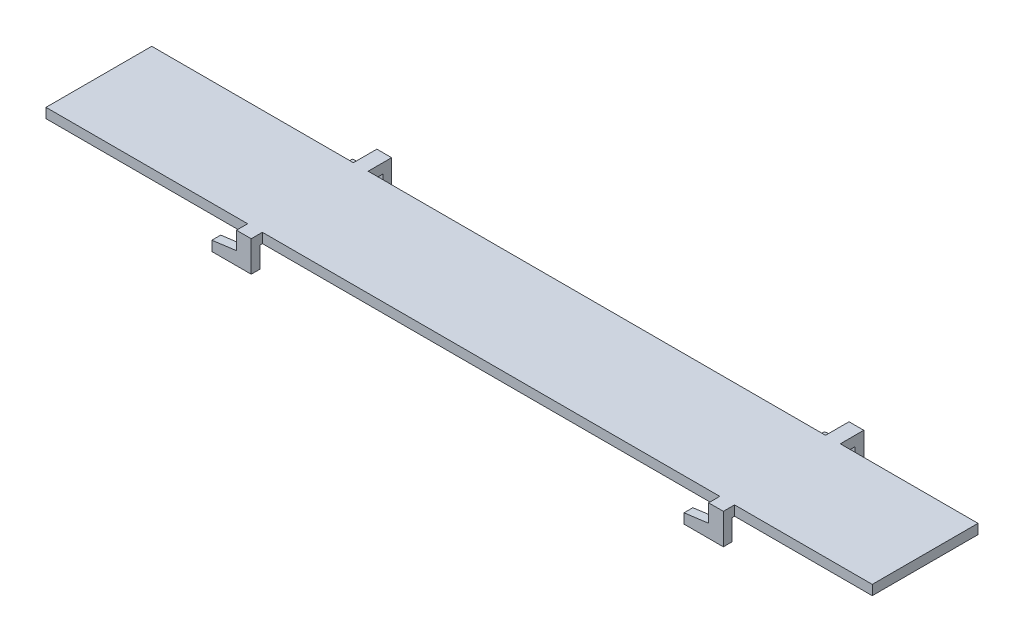
ISO-10303-21;
HEADER;
FILE_DESCRIPTION(('STEP AP214'),'2;1');
FILE_NAME('part.step','',(''),(''),'','','');
FILE_SCHEMA(('AUTOMOTIVE_DESIGN { 1 0 10303 214 1 1 1 1 }'));
ENDSEC;
DATA;
#1=APPLICATION_CONTEXT('core data for automotive mechanical design processes');
#2=APPLICATION_PROTOCOL_DEFINITION('international standard','automotive_design',2000,#1);
#3=PRODUCT_CONTEXT('',#1,'mechanical');
#4=PRODUCT('Part','Part','',(#3));
#5=PRODUCT_RELATED_PRODUCT_CATEGORY('part','',(#4));
#6=PRODUCT_DEFINITION_FORMATION('','',#4);
#7=PRODUCT_DEFINITION_CONTEXT('part definition',#1,'design');
#8=PRODUCT_DEFINITION('design','',#6,#7);
#9=PRODUCT_DEFINITION_SHAPE('','',#8);
#10=(LENGTH_UNIT() NAMED_UNIT(*) SI_UNIT(.MILLI.,.METRE.));
#11=(NAMED_UNIT(*) PLANE_ANGLE_UNIT() SI_UNIT($,.RADIAN.));
#12=(NAMED_UNIT(*) SI_UNIT($,.STERADIAN.) SOLID_ANGLE_UNIT());
#13=UNCERTAINTY_MEASURE_WITH_UNIT(LENGTH_MEASURE(1.E-05),#10,'distance_accuracy_value','');
#14=(GEOMETRIC_REPRESENTATION_CONTEXT(3) GLOBAL_UNCERTAINTY_ASSIGNED_CONTEXT((#13)) GLOBAL_UNIT_ASSIGNED_CONTEXT((#10,
#11,#12)) REPRESENTATION_CONTEXT('',''));
#15=CARTESIAN_POINT('',(0.,0.,0.));
#16=DIRECTION('',(0.,0.,1.));
#17=DIRECTION('',(1.,0.,0.));
#18=AXIS2_PLACEMENT_3D('',#15,#16,#17);
#19=CARTESIAN_POINT('',(-168.,2.,0.));
#20=DIRECTION('',(1.,0.,0.));
#21=DIRECTION('',(0.,0.,-1.));
#22=AXIS2_PLACEMENT_3D('',#19,#20,#21);
#23=PLANE('',#22);
#24=DIRECTION('',(0.,0.,1.));
#25=VECTOR('',#24,1.);
#26=CARTESIAN_POINT('',(-168.,0.,0.));
#27=LINE('',#26,#25);
#28=CARTESIAN_POINT('',(-168.,0.,0.));
#29=VERTEX_POINT('',#28);
#30=CARTESIAN_POINT('',(-168.,0.,21.5));
#31=VERTEX_POINT('',#30);
#32=EDGE_CURVE('E433',#29,#31,#27,.T.);
#33=ORIENTED_EDGE('',*,*,#32,.T.);
#34=DIRECTION('',(0.,-1.,0.));
#35=VECTOR('',#34,1.);
#36=CARTESIAN_POINT('',(-168.,2.,21.5));
#37=LINE('',#36,#35);
#38=CARTESIAN_POINT('',(-168.,2.,21.5));
#39=VERTEX_POINT('',#38);
#40=EDGE_CURVE('E533',#39,#31,#37,.T.);
#41=ORIENTED_EDGE('',*,*,#40,.F.);
#42=DIRECTION('',(0.,0.,1.));
#43=VECTOR('',#42,1.);
#44=CARTESIAN_POINT('',(-168.,2.,0.));
#45=LINE('',#44,#43);
#46=CARTESIAN_POINT('',(-168.,2.,0.));
#47=VERTEX_POINT('',#46);
#48=EDGE_CURVE('E434',#47,#39,#45,.T.);
#49=ORIENTED_EDGE('',*,*,#48,.F.);
#50=DIRECTION('',(0.,-1.,0.));
#51=VECTOR('',#50,1.);
#52=CARTESIAN_POINT('',(-168.,2.,0.));
#53=LINE('',#52,#51);
#54=EDGE_CURVE('E468',#47,#29,#53,.T.);
#55=ORIENTED_EDGE('',*,*,#54,.T.);
#56=EDGE_LOOP('',(#33,#41,#49,#55));
#57=FACE_BOUND('',#56,.T.);
#58=ADVANCED_FACE('F37',(#57),#23,.F.);
#59=CARTESIAN_POINT('',(-168.,2.,21.5));
#60=DIRECTION('',(0.,0.,-1.));
#61=DIRECTION('',(-1.,0.,0.));
#62=AXIS2_PLACEMENT_3D('',#59,#60,#61);
#63=PLANE('',#62);
#64=DIRECTION('',(1.,0.,0.));
#65=VECTOR('',#64,1.);
#66=CARTESIAN_POINT('',(-168.,0.,21.5));
#67=LINE('',#66,#65);
#68=CARTESIAN_POINT('',(-127.,0.,21.5));
#69=VERTEX_POINT('',#68);
#70=EDGE_CURVE('E471',#31,#69,#67,.T.);
#71=ORIENTED_EDGE('',*,*,#70,.T.);
#72=DIRECTION('',(0.,-1.,0.));
#73=VECTOR('',#72,1.);
#74=CARTESIAN_POINT('',(-127.,2.,21.5));
#75=LINE('',#74,#73);
#76=CARTESIAN_POINT('',(-127.,2.,21.5));
#77=VERTEX_POINT('',#76);
#78=EDGE_CURVE('E530',#77,#69,#75,.T.);
#79=ORIENTED_EDGE('',*,*,#78,.F.);
#80=DIRECTION('',(1.,0.,0.));
#81=VECTOR('',#80,1.);
#82=CARTESIAN_POINT('',(-168.,2.,21.5));
#83=LINE('',#82,#81);
#84=EDGE_CURVE('E437',#39,#77,#83,.T.);
#85=ORIENTED_EDGE('',*,*,#84,.F.);
#86=ORIENTED_EDGE('',*,*,#40,.T.);
#87=EDGE_LOOP('',(#71,#79,#85,#86));
#88=FACE_BOUND('',#87,.T.);
#89=ADVANCED_FACE('F555',(#88),#63,.F.);
#90=CARTESIAN_POINT('',(-127.,2.,22.875));
#91=DIRECTION('',(1.,0.,0.));
#92=DIRECTION('',(0.,0.,-1.));
#93=AXIS2_PLACEMENT_3D('',#90,#91,#92);
#94=PLANE('',#93);
#95=DIRECTION('',(0.,0.,1.));
#96=VECTOR('',#95,1.);
#97=CARTESIAN_POINT('',(-127.,0.,22.875));
#98=LINE('',#97,#96);
#99=CARTESIAN_POINT('',(-127.,0.,21.975));
#100=VERTEX_POINT('',#99);
#101=EDGE_CURVE('E473',#69,#100,#98,.T.);
#102=ORIENTED_EDGE('',*,*,#101,.T.);
#103=DIRECTION('',(0.,-1.,0.));
#104=VECTOR('',#103,1.);
#105=CARTESIAN_POINT('',(-127.,-1.6,21.975));
#106=LINE('',#105,#104);
#107=CARTESIAN_POINT('',(-127.,-1.6,21.975));
#108=VERTEX_POINT('',#107);
#109=EDGE_CURVE('E58',#100,#108,#106,.T.);
#110=ORIENTED_EDGE('',*,*,#109,.T.);
#111=DIRECTION('',(0.,0.,-1.));
#112=VECTOR('',#111,1.);
#113=CARTESIAN_POINT('',(-127.,-1.6,23.775));
#114=LINE('',#113,#112);
#115=CARTESIAN_POINT('',(-127.,-1.6,23.775));
#116=VERTEX_POINT('',#115);
#117=EDGE_CURVE('E352',#116,#108,#114,.T.);
#118=ORIENTED_EDGE('',*,*,#117,.F.);
#119=DIRECTION('',(0.,-1.,0.));
#120=VECTOR('',#119,1.);
#121=CARTESIAN_POINT('',(-127.,-1.6,23.775));
#122=LINE('',#121,#120);
#123=CARTESIAN_POINT('',(-127.,2.,23.775));
#124=VERTEX_POINT('',#123);
#125=EDGE_CURVE('E331',#124,#116,#122,.T.);
#126=ORIENTED_EDGE('',*,*,#125,.F.);
#127=DIRECTION('',(0.,0.,1.));
#128=VECTOR('',#127,1.);
#129=CARTESIAN_POINT('',(-127.,2.,22.875));
#130=LINE('',#129,#128);
#131=EDGE_CURVE('E440',#77,#124,#130,.T.);
#132=ORIENTED_EDGE('',*,*,#131,.F.);
#133=ORIENTED_EDGE('',*,*,#78,.T.);
#134=EDGE_LOOP('',(#102,#110,#118,#126,#132,#133));
#135=FACE_BOUND('',#134,.T.);
#136=ADVANCED_FACE('F549',(#135),#94,.F.);
#137=CARTESIAN_POINT('',(-124.,2.,21.5));
#138=DIRECTION('',(-1.,0.,0.));
#139=DIRECTION('',(0.,0.,1.));
#140=AXIS2_PLACEMENT_3D('',#137,#138,#139);
#141=PLANE('',#140);
#142=DIRECTION('',(0.,0.,-1.));
#143=VECTOR('',#142,1.);
#144=CARTESIAN_POINT('',(-124.,2.,21.5));
#145=LINE('',#144,#143);
#146=CARTESIAN_POINT('',(-124.,2.,23.775));
#147=VERTEX_POINT('',#146);
#148=CARTESIAN_POINT('',(-124.,2.,21.5));
#149=VERTEX_POINT('',#148);
#150=EDGE_CURVE('E442',#147,#149,#145,.T.);
#151=ORIENTED_EDGE('',*,*,#150,.F.);
#152=DIRECTION('',(0.,1.,0.));
#153=VECTOR('',#152,1.);
#154=CARTESIAN_POINT('',(-124.,2.,23.775));
#155=LINE('',#154,#153);
#156=CARTESIAN_POINT('',(-124.,-4.25826248793698,23.775));
#157=VERTEX_POINT('',#156);
#158=EDGE_CURVE('E340',#157,#147,#155,.T.);
#159=ORIENTED_EDGE('',*,*,#158,.F.);
#160=DIRECTION('',(0.,0.,-1.));
#161=VECTOR('',#160,1.);
#162=CARTESIAN_POINT('',(-124.,-4.25826248793698,23.775));
#163=LINE('',#162,#161);
#164=CARTESIAN_POINT('',(-124.,-4.25826248793698,21.975));
#165=VERTEX_POINT('',#164);
#166=EDGE_CURVE('E346',#157,#165,#163,.T.);
#167=ORIENTED_EDGE('',*,*,#166,.T.);
#168=DIRECTION('',(0.,1.,0.));
#169=VECTOR('',#168,1.);
#170=CARTESIAN_POINT('',(-124.,2.,21.975));
#171=LINE('',#170,#169);
#172=CARTESIAN_POINT('',(-124.,0.,21.975));
#173=VERTEX_POINT('',#172);
#174=EDGE_CURVE('E328',#165,#173,#171,.T.);
#175=ORIENTED_EDGE('',*,*,#174,.T.);
#176=DIRECTION('',(0.,0.,-1.));
#177=VECTOR('',#176,1.);
#178=CARTESIAN_POINT('',(-124.,0.,21.5));
#179=LINE('',#178,#177);
#180=CARTESIAN_POINT('',(-124.,0.,21.5));
#181=VERTEX_POINT('',#180);
#182=EDGE_CURVE('E476',#173,#181,#179,.T.);
#183=ORIENTED_EDGE('',*,*,#182,.T.);
#184=DIRECTION('',(0.,-1.,0.));
#185=VECTOR('',#184,1.);
#186=CARTESIAN_POINT('',(-124.,2.,21.5));
#187=LINE('',#186,#185);
#188=EDGE_CURVE('E527',#149,#181,#187,.T.);
#189=ORIENTED_EDGE('',*,*,#188,.F.);
#190=EDGE_LOOP('',(#151,#159,#167,#175,#183,#189));
#191=FACE_BOUND('',#190,.T.);
#192=ADVANCED_FACE('F653',(#191),#141,.F.);
#193=CARTESIAN_POINT('',(-124.,2.,21.5));
#194=DIRECTION('',(0.,0.,-1.));
#195=DIRECTION('',(-1.,0.,0.));
#196=AXIS2_PLACEMENT_3D('',#193,#194,#195);
#197=PLANE('',#196);
#198=DIRECTION('',(1.,0.,0.));
#199=VECTOR('',#198,1.);
#200=CARTESIAN_POINT('',(-124.,0.,21.5));
#201=LINE('',#200,#199);
#202=CARTESIAN_POINT('',(-31.,0.,21.5));
#203=VERTEX_POINT('',#202);
#204=EDGE_CURVE('E478',#181,#203,#201,.T.);
#205=ORIENTED_EDGE('',*,*,#204,.T.);
#206=DIRECTION('',(0.,-1.,0.));
#207=VECTOR('',#206,1.);
#208=CARTESIAN_POINT('',(-31.,2.,21.5));
#209=LINE('',#208,#207);
#210=CARTESIAN_POINT('',(-31.,2.,21.5));
#211=VERTEX_POINT('',#210);
#212=EDGE_CURVE('E524',#211,#203,#209,.T.);
#213=ORIENTED_EDGE('',*,*,#212,.F.);
#214=DIRECTION('',(1.,0.,0.));
#215=VECTOR('',#214,1.);
#216=CARTESIAN_POINT('',(-124.,2.,21.5));
#217=LINE('',#216,#215);
#218=EDGE_CURVE('E444',#149,#211,#217,.T.);
#219=ORIENTED_EDGE('',*,*,#218,.F.);
#220=ORIENTED_EDGE('',*,*,#188,.T.);
#221=EDGE_LOOP('',(#205,#213,#219,#220));
#222=FACE_BOUND('',#221,.T.);
#223=ADVANCED_FACE('F649',(#222),#197,.F.);
#224=CARTESIAN_POINT('',(-31.,2.,21.5));
#225=DIRECTION('',(1.,0.,0.));
#226=DIRECTION('',(0.,0.,-1.));
#227=AXIS2_PLACEMENT_3D('',#224,#225,#226);
#228=PLANE('',#227);
#229=DIRECTION('',(0.,0.,1.));
#230=VECTOR('',#229,1.);
#231=CARTESIAN_POINT('',(-31.,0.,21.5));
#232=LINE('',#231,#230);
#233=CARTESIAN_POINT('',(-31.,0.,21.975));
#234=VERTEX_POINT('',#233);
#235=EDGE_CURVE('E480',#203,#234,#232,.T.);
#236=ORIENTED_EDGE('',*,*,#235,.T.);
#237=DIRECTION('',(0.,-1.,0.));
#238=VECTOR('',#237,1.);
#239=CARTESIAN_POINT('',(-31.,-1.6,21.975));
#240=LINE('',#239,#238);
#241=CARTESIAN_POINT('',(-31.,-1.6,21.975));
#242=VERTEX_POINT('',#241);
#243=EDGE_CURVE('E389',#234,#242,#240,.T.);
#244=ORIENTED_EDGE('',*,*,#243,.T.);
#245=DIRECTION('',(0.,0.,-1.));
#246=VECTOR('',#245,1.);
#247=CARTESIAN_POINT('',(-31.,-1.6,23.775));
#248=LINE('',#247,#246);
#249=CARTESIAN_POINT('',(-31.,-1.6,23.775));
#250=VERTEX_POINT('',#249);
#251=EDGE_CURVE('E430',#250,#242,#248,.T.);
#252=ORIENTED_EDGE('',*,*,#251,.F.);
#253=DIRECTION('',(0.,-1.,0.));
#254=VECTOR('',#253,1.);
#255=CARTESIAN_POINT('',(-31.,-1.6,23.775));
#256=LINE('',#255,#254);
#257=CARTESIAN_POINT('',(-31.,2.,23.775));
#258=VERTEX_POINT('',#257);
#259=EDGE_CURVE('E409',#258,#250,#256,.T.);
#260=ORIENTED_EDGE('',*,*,#259,.F.);
#261=DIRECTION('',(0.,0.,1.));
#262=VECTOR('',#261,1.);
#263=CARTESIAN_POINT('',(-31.,2.,21.5));
#264=LINE('',#263,#262);
#265=EDGE_CURVE('E446',#211,#258,#264,.T.);
#266=ORIENTED_EDGE('',*,*,#265,.F.);
#267=ORIENTED_EDGE('',*,*,#212,.T.);
#268=EDGE_LOOP('',(#236,#244,#252,#260,#266,#267));
#269=FACE_BOUND('',#268,.T.);
#270=ADVANCED_FACE('F645',(#269),#228,.F.);
#271=CARTESIAN_POINT('',(-28.,2.,21.5));
#272=DIRECTION('',(-1.,0.,0.));
#273=DIRECTION('',(0.,0.,1.));
#274=AXIS2_PLACEMENT_3D('',#271,#272,#273);
#275=PLANE('',#274);
#276=DIRECTION('',(0.,0.,-1.));
#277=VECTOR('',#276,1.);
#278=CARTESIAN_POINT('',(-28.,2.,21.5));
#279=LINE('',#278,#277);
#280=CARTESIAN_POINT('',(-28.,2.,23.775));
#281=VERTEX_POINT('',#280);
#282=CARTESIAN_POINT('',(-28.,2.,21.5));
#283=VERTEX_POINT('',#282);
#284=EDGE_CURVE('E448',#281,#283,#279,.T.);
#285=ORIENTED_EDGE('',*,*,#284,.F.);
#286=DIRECTION('',(0.,1.,0.));
#287=VECTOR('',#286,1.);
#288=CARTESIAN_POINT('',(-28.,2.,23.775));
#289=LINE('',#288,#287);
#290=CARTESIAN_POINT('',(-28.,-4.25826248793698,23.775));
#291=VERTEX_POINT('',#290);
#292=EDGE_CURVE('E418',#291,#281,#289,.T.);
#293=ORIENTED_EDGE('',*,*,#292,.F.);
#294=DIRECTION('',(0.,0.,-1.));
#295=VECTOR('',#294,1.);
#296=CARTESIAN_POINT('',(-28.,-4.25826248793698,23.775));
#297=LINE('',#296,#295);
#298=CARTESIAN_POINT('',(-28.,-4.25826248793698,21.975));
#299=VERTEX_POINT('',#298);
#300=EDGE_CURVE('E424',#291,#299,#297,.T.);
#301=ORIENTED_EDGE('',*,*,#300,.T.);
#302=DIRECTION('',(0.,1.,0.));
#303=VECTOR('',#302,1.);
#304=CARTESIAN_POINT('',(-28.,2.,21.975));
#305=LINE('',#304,#303);
#306=CARTESIAN_POINT('',(-28.,0.,21.975));
#307=VERTEX_POINT('',#306);
#308=EDGE_CURVE('E406',#299,#307,#305,.T.);
#309=ORIENTED_EDGE('',*,*,#308,.T.);
#310=DIRECTION('',(0.,0.,-1.));
#311=VECTOR('',#310,1.);
#312=CARTESIAN_POINT('',(-28.,0.,21.5));
#313=LINE('',#312,#311);
#314=CARTESIAN_POINT('',(-28.,0.,21.5));
#315=VERTEX_POINT('',#314);
#316=EDGE_CURVE('E483',#307,#315,#313,.T.);
#317=ORIENTED_EDGE('',*,*,#316,.T.);
#318=DIRECTION('',(0.,-1.,0.));
#319=VECTOR('',#318,1.);
#320=CARTESIAN_POINT('',(-28.,2.,21.5));
#321=LINE('',#320,#319);
#322=EDGE_CURVE('E521',#283,#315,#321,.T.);
#323=ORIENTED_EDGE('',*,*,#322,.F.);
#324=EDGE_LOOP('',(#285,#293,#301,#309,#317,#323));
#325=FACE_BOUND('',#324,.T.);
#326=ADVANCED_FACE('F623',(#325),#275,.F.);
#327=CARTESIAN_POINT('',(-28.,2.,21.5));
#328=DIRECTION('',(0.,0.,-1.));
#329=DIRECTION('',(-1.,0.,0.));
#330=AXIS2_PLACEMENT_3D('',#327,#328,#329);
#331=PLANE('',#330);
#332=DIRECTION('',(1.,0.,0.));
#333=VECTOR('',#332,1.);
#334=CARTESIAN_POINT('',(-28.,0.,21.5));
#335=LINE('',#334,#333);
#336=CARTESIAN_POINT('',(0.,0.,21.5));
#337=VERTEX_POINT('',#336);
#338=EDGE_CURVE('E485',#315,#337,#335,.T.);
#339=ORIENTED_EDGE('',*,*,#338,.T.);
#340=DIRECTION('',(0.,-1.,0.));
#341=VECTOR('',#340,1.);
#342=CARTESIAN_POINT('',(0.,2.,21.5));
#343=LINE('',#342,#341);
#344=CARTESIAN_POINT('',(0.,2.,21.5));
#345=VERTEX_POINT('',#344);
#346=EDGE_CURVE('E518',#345,#337,#343,.T.);
#347=ORIENTED_EDGE('',*,*,#346,.F.);
#348=DIRECTION('',(1.,0.,0.));
#349=VECTOR('',#348,1.);
#350=CARTESIAN_POINT('',(-28.,2.,21.5));
#351=LINE('',#350,#349);
#352=EDGE_CURVE('E450',#283,#345,#351,.T.);
#353=ORIENTED_EDGE('',*,*,#352,.F.);
#354=ORIENTED_EDGE('',*,*,#322,.T.);
#355=EDGE_LOOP('',(#339,#347,#353,#354));
#356=FACE_BOUND('',#355,.T.);
#357=ADVANCED_FACE('F618',(#356),#331,.F.);
#358=CARTESIAN_POINT('',(0.,2.,0.));
#359=DIRECTION('',(-1.,0.,0.));
#360=DIRECTION('',(0.,0.,1.));
#361=AXIS2_PLACEMENT_3D('',#358,#359,#360);
#362=PLANE('',#361);
#363=DIRECTION('',(0.,0.,-1.));
#364=VECTOR('',#363,1.);
#365=CARTESIAN_POINT('',(0.,0.,0.));
#366=LINE('',#365,#364);
#367=CARTESIAN_POINT('',(0.,0.,0.));
#368=VERTEX_POINT('',#367);
#369=EDGE_CURVE('E487',#337,#368,#366,.T.);
#370=ORIENTED_EDGE('',*,*,#369,.T.);
#371=DIRECTION('',(0.,-1.,0.));
#372=VECTOR('',#371,1.);
#373=CARTESIAN_POINT('',(0.,2.,0.));
#374=LINE('',#373,#372);
#375=CARTESIAN_POINT('',(0.,2.,0.));
#376=VERTEX_POINT('',#375);
#377=EDGE_CURVE('E515',#376,#368,#374,.T.);
#378=ORIENTED_EDGE('',*,*,#377,.F.);
#379=DIRECTION('',(0.,0.,-1.));
#380=VECTOR('',#379,1.);
#381=CARTESIAN_POINT('',(0.,2.,0.));
#382=LINE('',#381,#380);
#383=EDGE_CURVE('E452',#345,#376,#382,.T.);
#384=ORIENTED_EDGE('',*,*,#383,.F.);
#385=ORIENTED_EDGE('',*,*,#346,.T.);
#386=EDGE_LOOP('',(#370,#378,#384,#385));
#387=FACE_BOUND('',#386,.T.);
#388=ADVANCED_FACE('F614',(#387),#362,.F.);
#389=CARTESIAN_POINT('',(-28.,2.,0.));
#390=DIRECTION('',(0.,0.,1.));
#391=DIRECTION('',(1.,0.,0.));
#392=AXIS2_PLACEMENT_3D('',#389,#390,#391);
#393=PLANE('',#392);
#394=DIRECTION('',(-1.,0.,0.));
#395=VECTOR('',#394,1.);
#396=CARTESIAN_POINT('',(-28.,0.,0.));
#397=LINE('',#396,#395);
#398=CARTESIAN_POINT('',(-28.,0.,0.));
#399=VERTEX_POINT('',#398);
#400=EDGE_CURVE('E489',#368,#399,#397,.T.);
#401=ORIENTED_EDGE('',*,*,#400,.T.);
#402=DIRECTION('',(0.,-1.,0.));
#403=VECTOR('',#402,1.);
#404=CARTESIAN_POINT('',(-28.,2.,0.));
#405=LINE('',#404,#403);
#406=CARTESIAN_POINT('',(-28.,2.,0.));
#407=VERTEX_POINT('',#406);
#408=EDGE_CURVE('E512',#407,#399,#405,.T.);
#409=ORIENTED_EDGE('',*,*,#408,.F.);
#410=DIRECTION('',(-1.,0.,0.));
#411=VECTOR('',#410,1.);
#412=CARTESIAN_POINT('',(-28.,2.,0.));
#413=LINE('',#412,#411);
#414=EDGE_CURVE('E454',#376,#407,#413,.T.);
#415=ORIENTED_EDGE('',*,*,#414,.F.);
#416=ORIENTED_EDGE('',*,*,#377,.T.);
#417=EDGE_LOOP('',(#401,#409,#415,#416));
#418=FACE_BOUND('',#417,.T.);
#419=ADVANCED_FACE('F609',(#418),#393,.F.);
#420=CARTESIAN_POINT('',(-28.,2.,0.));
#421=DIRECTION('',(-1.,0.,0.));
#422=DIRECTION('',(0.,0.,1.));
#423=AXIS2_PLACEMENT_3D('',#420,#421,#422);
#424=PLANE('',#423);
#425=DIRECTION('',(0.,0.,-1.));
#426=VECTOR('',#425,1.);
#427=CARTESIAN_POINT('',(-28.,0.,0.));
#428=LINE('',#427,#426);
#429=CARTESIAN_POINT('',(-28.,0.,-2.975));
#430=VERTEX_POINT('',#429);
#431=EDGE_CURVE('E491',#399,#430,#428,.T.);
#432=ORIENTED_EDGE('',*,*,#431,.T.);
#433=DIRECTION('',(0.,1.,0.));
#434=VECTOR('',#433,1.);
#435=CARTESIAN_POINT('',(-28.,2.,-2.975));
#436=LINE('',#435,#434);
#437=CARTESIAN_POINT('',(-28.,-4.25826248793698,-2.975));
#438=VERTEX_POINT('',#437);
#439=EDGE_CURVE('E358',#438,#430,#436,.T.);
#440=ORIENTED_EDGE('',*,*,#439,.F.);
#441=DIRECTION('',(0.,0.,1.));
#442=VECTOR('',#441,1.);
#443=CARTESIAN_POINT('',(-28.,-4.25826248793698,-4.775));
#444=LINE('',#443,#442);
#445=CARTESIAN_POINT('',(-28.,-4.25826248793698,-4.775));
#446=VERTEX_POINT('',#445);
#447=EDGE_CURVE('E386',#446,#438,#444,.T.);
#448=ORIENTED_EDGE('',*,*,#447,.F.);
#449=DIRECTION('',(0.,1.,0.));
#450=VECTOR('',#449,1.);
#451=CARTESIAN_POINT('',(-28.,2.,-4.775));
#452=LINE('',#451,#450);
#453=CARTESIAN_POINT('',(-28.,2.,-4.775));
#454=VERTEX_POINT('',#453);
#455=EDGE_CURVE('E371',#446,#454,#452,.T.);
#456=ORIENTED_EDGE('',*,*,#455,.T.);
#457=DIRECTION('',(0.,0.,-1.));
#458=VECTOR('',#457,1.);
#459=CARTESIAN_POINT('',(-28.,2.,0.));
#460=LINE('',#459,#458);
#461=EDGE_CURVE('E456',#407,#454,#460,.T.);
#462=ORIENTED_EDGE('',*,*,#461,.F.);
#463=ORIENTED_EDGE('',*,*,#408,.T.);
#464=EDGE_LOOP('',(#432,#440,#448,#456,#462,#463));
#465=FACE_BOUND('',#464,.T.);
#466=ADVANCED_FACE('F601',(#465),#424,.F.);
#467=CARTESIAN_POINT('',(-31.,2.,-3.875));
#468=DIRECTION('',(1.,0.,0.));
#469=DIRECTION('',(0.,0.,-1.));
#470=AXIS2_PLACEMENT_3D('',#467,#468,#469);
#471=PLANE('',#470);
#472=DIRECTION('',(0.,-1.,0.));
#473=VECTOR('',#472,1.);
#474=CARTESIAN_POINT('',(-31.,2.,0.));
#475=LINE('',#474,#473);
#476=CARTESIAN_POINT('',(-31.,2.,0.));
#477=VERTEX_POINT('',#476);
#478=CARTESIAN_POINT('',(-31.,0.,0.));
#479=VERTEX_POINT('',#478);
#480=EDGE_CURVE('E509',#477,#479,#475,.T.);
#481=ORIENTED_EDGE('',*,*,#480,.F.);
#482=DIRECTION('',(0.,0.,1.));
#483=VECTOR('',#482,1.);
#484=CARTESIAN_POINT('',(-31.,2.,-3.875));
#485=LINE('',#484,#483);
#486=CARTESIAN_POINT('',(-31.,2.,-4.775));
#487=VERTEX_POINT('',#486);
#488=EDGE_CURVE('E458',#487,#477,#485,.T.);
#489=ORIENTED_EDGE('',*,*,#488,.F.);
#490=DIRECTION('',(0.,-1.,0.));
#491=VECTOR('',#490,1.);
#492=CARTESIAN_POINT('',(-31.,2.,-4.775));
#493=LINE('',#492,#491);
#494=CARTESIAN_POINT('',(-31.,-1.6,-4.775));
#495=VERTEX_POINT('',#494);
#496=EDGE_CURVE('E377',#487,#495,#493,.T.);
#497=ORIENTED_EDGE('',*,*,#496,.T.);
#498=DIRECTION('',(0.,0.,1.));
#499=VECTOR('',#498,1.);
#500=CARTESIAN_POINT('',(-31.,-1.6,-4.775));
#501=LINE('',#500,#499);
#502=CARTESIAN_POINT('',(-31.,-1.6,-2.975));
#503=VERTEX_POINT('',#502);
#504=EDGE_CURVE('E392',#495,#503,#501,.T.);
#505=ORIENTED_EDGE('',*,*,#504,.T.);
#506=DIRECTION('',(0.,-1.,0.));
#507=VECTOR('',#506,1.);
#508=CARTESIAN_POINT('',(-31.,2.,-2.975));
#509=LINE('',#508,#507);
#510=CARTESIAN_POINT('',(-31.,0.,-2.975));
#511=VERTEX_POINT('',#510);
#512=EDGE_CURVE('E360',#511,#503,#509,.T.);
#513=ORIENTED_EDGE('',*,*,#512,.F.);
#514=DIRECTION('',(0.,0.,1.));
#515=VECTOR('',#514,1.);
#516=CARTESIAN_POINT('',(-31.,0.,-3.875));
#517=LINE('',#516,#515);
#518=EDGE_CURVE('E494',#511,#479,#517,.T.);
#519=ORIENTED_EDGE('',*,*,#518,.T.);
#520=EDGE_LOOP('',(#481,#489,#497,#505,#513,#519));
#521=FACE_BOUND('',#520,.T.);
#522=ADVANCED_FACE('F593',(#521),#471,.F.);
#523=CARTESIAN_POINT('',(-124.,2.,0.));
#524=DIRECTION('',(0.,0.,1.));
#525=DIRECTION('',(1.,0.,0.));
#526=AXIS2_PLACEMENT_3D('',#523,#524,#525);
#527=PLANE('',#526);
#528=DIRECTION('',(-1.,0.,0.));
#529=VECTOR('',#528,1.);
#530=CARTESIAN_POINT('',(-124.,0.,0.));
#531=LINE('',#530,#529);
#532=CARTESIAN_POINT('',(-124.,0.,0.));
#533=VERTEX_POINT('',#532);
#534=EDGE_CURVE('E496',#479,#533,#531,.T.);
#535=ORIENTED_EDGE('',*,*,#534,.T.);
#536=DIRECTION('',(0.,-1.,0.));
#537=VECTOR('',#536,1.);
#538=CARTESIAN_POINT('',(-124.,2.,0.));
#539=LINE('',#538,#537);
#540=CARTESIAN_POINT('',(-124.,2.,0.));
#541=VERTEX_POINT('',#540);
#542=EDGE_CURVE('E507',#541,#533,#539,.T.);
#543=ORIENTED_EDGE('',*,*,#542,.F.);
#544=DIRECTION('',(-1.,0.,0.));
#545=VECTOR('',#544,1.);
#546=CARTESIAN_POINT('',(-124.,2.,0.));
#547=LINE('',#546,#545);
#548=EDGE_CURVE('E460',#477,#541,#547,.T.);
#549=ORIENTED_EDGE('',*,*,#548,.F.);
#550=ORIENTED_EDGE('',*,*,#480,.T.);
#551=EDGE_LOOP('',(#535,#543,#549,#550));
#552=FACE_BOUND('',#551,.T.);
#553=ADVANCED_FACE('F588',(#552),#527,.F.);
#554=CARTESIAN_POINT('',(-124.,2.,0.));
#555=DIRECTION('',(-1.,0.,0.));
#556=DIRECTION('',(0.,0.,1.));
#557=AXIS2_PLACEMENT_3D('',#554,#555,#556);
#558=PLANE('',#557);
#559=DIRECTION('',(0.,0.,-1.));
#560=VECTOR('',#559,1.);
#561=CARTESIAN_POINT('',(-124.,0.,0.));
#562=LINE('',#561,#560);
#563=CARTESIAN_POINT('',(-124.,0.,-2.975));
#564=VERTEX_POINT('',#563);
#565=EDGE_CURVE('E284',#533,#564,#562,.T.);
#566=ORIENTED_EDGE('',*,*,#565,.T.);
#567=DIRECTION('',(0.,1.,0.));
#568=VECTOR('',#567,1.);
#569=CARTESIAN_POINT('',(-124.,2.,-2.975));
#570=LINE('',#569,#568);
#571=CARTESIAN_POINT('',(-124.,-4.25826248793698,-2.975));
#572=VERTEX_POINT('',#571);
#573=EDGE_CURVE('E51',#572,#564,#570,.T.);
#574=ORIENTED_EDGE('',*,*,#573,.F.);
#575=DIRECTION('',(0.,0.,1.));
#576=VECTOR('',#575,1.);
#577=CARTESIAN_POINT('',(-124.,-4.25826248793698,-4.775));
#578=LINE('',#577,#576);
#579=CARTESIAN_POINT('',(-124.,-4.25826248793698,-4.775));
#580=VERTEX_POINT('',#579);
#581=EDGE_CURVE('E269',#580,#572,#578,.T.);
#582=ORIENTED_EDGE('',*,*,#581,.F.);
#583=DIRECTION('',(0.,1.,0.));
#584=VECTOR('',#583,1.);
#585=CARTESIAN_POINT('',(-124.,2.,-4.775));
#586=LINE('',#585,#584);
#587=CARTESIAN_POINT('',(-124.,2.,-4.775));
#588=VERTEX_POINT('',#587);
#589=EDGE_CURVE('E299',#580,#588,#586,.T.);
#590=ORIENTED_EDGE('',*,*,#589,.T.);
#591=DIRECTION('',(0.,0.,-1.));
#592=VECTOR('',#591,1.);
#593=CARTESIAN_POINT('',(-124.,2.,0.));
#594=LINE('',#593,#592);
#595=EDGE_CURVE('E462',#541,#588,#594,.T.);
#596=ORIENTED_EDGE('',*,*,#595,.F.);
#597=ORIENTED_EDGE('',*,*,#542,.T.);
#598=EDGE_LOOP('',(#566,#574,#582,#590,#596,#597));
#599=FACE_BOUND('',#598,.T.);
#600=ADVANCED_FACE('F281',(#599),#558,.F.);
#601=CARTESIAN_POINT('',(-127.,2.,-3.87499999999999));
#602=DIRECTION('',(1.,0.,0.));
#603=DIRECTION('',(0.,0.,-1.));
#604=AXIS2_PLACEMENT_3D('',#601,#602,#603);
#605=PLANE('',#604);
#606=DIRECTION('',(0.,-1.,0.));
#607=VECTOR('',#606,1.);
#608=CARTESIAN_POINT('',(-127.,2.,0.));
#609=LINE('',#608,#607);
#610=CARTESIAN_POINT('',(-127.,2.,0.));
#611=VERTEX_POINT('',#610);
#612=CARTESIAN_POINT('',(-127.,0.,0.));
#613=VERTEX_POINT('',#612);
#614=EDGE_CURVE('E504',#611,#613,#609,.T.);
#615=ORIENTED_EDGE('',*,*,#614,.F.);
#616=DIRECTION('',(0.,0.,1.));
#617=VECTOR('',#616,1.);
#618=CARTESIAN_POINT('',(-127.,2.,-3.87499999999999));
#619=LINE('',#618,#617);
#620=CARTESIAN_POINT('',(-127.,2.,-4.775));
#621=VERTEX_POINT('',#620);
#622=EDGE_CURVE('E464',#621,#611,#619,.T.);
#623=ORIENTED_EDGE('',*,*,#622,.F.);
#624=DIRECTION('',(0.,-1.,0.));
#625=VECTOR('',#624,1.);
#626=CARTESIAN_POINT('',(-127.,2.,-4.775));
#627=LINE('',#626,#625);
#628=CARTESIAN_POINT('',(-127.,-1.6,-4.775));
#629=VERTEX_POINT('',#628);
#630=EDGE_CURVE('E304',#621,#629,#627,.T.);
#631=ORIENTED_EDGE('',*,*,#630,.T.);
#632=DIRECTION('',(0.,0.,1.));
#633=VECTOR('',#632,1.);
#634=CARTESIAN_POINT('',(-127.,-1.6,-4.775));
#635=LINE('',#634,#633);
#636=CARTESIAN_POINT('',(-127.,-1.6,-2.975));
#637=VERTEX_POINT('',#636);
#638=EDGE_CURVE('E277',#629,#637,#635,.T.);
#639=ORIENTED_EDGE('',*,*,#638,.T.);
#640=DIRECTION('',(0.,-1.,0.));
#641=VECTOR('',#640,1.);
#642=CARTESIAN_POINT('',(-127.,2.,-2.975));
#643=LINE('',#642,#641);
#644=CARTESIAN_POINT('',(-127.,0.,-2.975));
#645=VERTEX_POINT('',#644);
#646=EDGE_CURVE('E285',#645,#637,#643,.T.);
#647=ORIENTED_EDGE('',*,*,#646,.F.);
#648=DIRECTION('',(0.,0.,1.));
#649=VECTOR('',#648,1.);
#650=CARTESIAN_POINT('',(-127.,0.,-3.87499999999999));
#651=LINE('',#650,#649);
#652=EDGE_CURVE('E499',#645,#613,#651,.T.);
#653=ORIENTED_EDGE('',*,*,#652,.T.);
#654=EDGE_LOOP('',(#615,#623,#631,#639,#647,#653));
#655=FACE_BOUND('',#654,.T.);
#656=ADVANCED_FACE('F567',(#655),#605,.F.);
#657=CARTESIAN_POINT('',(-168.,2.,0.));
#658=DIRECTION('',(0.,0.,1.));
#659=DIRECTION('',(1.,0.,0.));
#660=AXIS2_PLACEMENT_3D('',#657,#658,#659);
#661=PLANE('',#660);
#662=DIRECTION('',(-1.,0.,0.));
#663=VECTOR('',#662,1.);
#664=CARTESIAN_POINT('',(-168.,0.,0.));
#665=LINE('',#664,#663);
#666=EDGE_CURVE('E438',#613,#29,#665,.T.);
#667=ORIENTED_EDGE('',*,*,#666,.T.);
#668=ORIENTED_EDGE('',*,*,#54,.F.);
#669=DIRECTION('',(-1.,0.,0.));
#670=VECTOR('',#669,1.);
#671=CARTESIAN_POINT('',(-168.,2.,0.));
#672=LINE('',#671,#670);
#673=EDGE_CURVE('E466',#611,#47,#672,.T.);
#674=ORIENTED_EDGE('',*,*,#673,.F.);
#675=ORIENTED_EDGE('',*,*,#614,.T.);
#676=EDGE_LOOP('',(#667,#668,#674,#675));
#677=FACE_BOUND('',#676,.T.);
#678=ADVANCED_FACE('F564',(#677),#661,.F.);
#679=CARTESIAN_POINT('',(0.,2.,0.));
#680=DIRECTION('',(0.,1.,0.));
#681=DIRECTION('',(0.,0.,1.));
#682=AXIS2_PLACEMENT_3D('',#679,#680,#681);
#683=PLANE('',#682);
#684=ORIENTED_EDGE('',*,*,#622,.T.);
#685=ORIENTED_EDGE('',*,*,#673,.T.);
#686=ORIENTED_EDGE('',*,*,#48,.T.);
#687=ORIENTED_EDGE('',*,*,#84,.T.);
#688=ORIENTED_EDGE('',*,*,#131,.T.);
#689=DIRECTION('',(-1.,0.,0.));
#690=VECTOR('',#689,1.);
#691=CARTESIAN_POINT('',(-127.,2.,23.775));
#692=LINE('',#691,#690);
#693=EDGE_CURVE('E343',#147,#124,#692,.T.);
#694=ORIENTED_EDGE('',*,*,#693,.F.);
#695=ORIENTED_EDGE('',*,*,#150,.T.);
#696=ORIENTED_EDGE('',*,*,#218,.T.);
#697=ORIENTED_EDGE('',*,*,#265,.T.);
#698=DIRECTION('',(-1.,0.,0.));
#699=VECTOR('',#698,1.);
#700=CARTESIAN_POINT('',(-31.,2.,23.775));
#701=LINE('',#700,#699);
#702=EDGE_CURVE('E421',#281,#258,#701,.T.);
#703=ORIENTED_EDGE('',*,*,#702,.F.);
#704=ORIENTED_EDGE('',*,*,#284,.T.);
#705=ORIENTED_EDGE('',*,*,#352,.T.);
#706=ORIENTED_EDGE('',*,*,#383,.T.);
#707=ORIENTED_EDGE('',*,*,#414,.T.);
#708=ORIENTED_EDGE('',*,*,#461,.T.);
#709=DIRECTION('',(-1.,0.,0.));
#710=VECTOR('',#709,1.);
#711=CARTESIAN_POINT('',(-31.,2.,-4.775));
#712=LINE('',#711,#710);
#713=EDGE_CURVE('E374',#454,#487,#712,.T.);
#714=ORIENTED_EDGE('',*,*,#713,.T.);
#715=ORIENTED_EDGE('',*,*,#488,.T.);
#716=ORIENTED_EDGE('',*,*,#548,.T.);
#717=ORIENTED_EDGE('',*,*,#595,.T.);
#718=DIRECTION('',(-1.,0.,0.));
#719=VECTOR('',#718,1.);
#720=CARTESIAN_POINT('',(-31.,2.,-4.775));
#721=LINE('',#720,#719);
#722=EDGE_CURVE('E301',#588,#621,#721,.T.);
#723=ORIENTED_EDGE('',*,*,#722,.T.);
#724=EDGE_LOOP('',(#684,#685,#686,#687,#688,#694,#695,#696,#697,#703,#704,#705,#706,#707,#708,
#714,#715,#716,#717,#723));
#725=FACE_BOUND('',#724,.T.);
#726=ADVANCED_FACE('F584',(#725),#683,.T.);
#727=CARTESIAN_POINT('',(0.,0.,0.));
#728=DIRECTION('',(0.,1.,0.));
#729=DIRECTION('',(0.,0.,1.));
#730=AXIS2_PLACEMENT_3D('',#727,#728,#729);
#731=PLANE('',#730);
#732=ORIENTED_EDGE('',*,*,#652,.F.);
#733=DIRECTION('',(1.,0.,0.));
#734=VECTOR('',#733,1.);
#735=CARTESIAN_POINT('',(0.,0.,-2.975));
#736=LINE('',#735,#734);
#737=EDGE_CURVE('E11',#645,#564,#736,.T.);
#738=ORIENTED_EDGE('',*,*,#737,.T.);
#739=ORIENTED_EDGE('',*,*,#565,.F.);
#740=ORIENTED_EDGE('',*,*,#534,.F.);
#741=ORIENTED_EDGE('',*,*,#518,.F.);
#742=DIRECTION('',(1.,0.,0.));
#743=VECTOR('',#742,1.);
#744=CARTESIAN_POINT('',(0.,0.,-2.975));
#745=LINE('',#744,#743);
#746=EDGE_CURVE('E539',#511,#430,#745,.T.);
#747=ORIENTED_EDGE('',*,*,#746,.T.);
#748=ORIENTED_EDGE('',*,*,#431,.F.);
#749=ORIENTED_EDGE('',*,*,#400,.F.);
#750=ORIENTED_EDGE('',*,*,#369,.F.);
#751=ORIENTED_EDGE('',*,*,#338,.F.);
#752=ORIENTED_EDGE('',*,*,#316,.F.);
#753=DIRECTION('',(-1.,0.,0.));
#754=VECTOR('',#753,1.);
#755=CARTESIAN_POINT('',(0.,0.,21.975));
#756=LINE('',#755,#754);
#757=EDGE_CURVE('E536',#307,#234,#756,.T.);
#758=ORIENTED_EDGE('',*,*,#757,.T.);
#759=ORIENTED_EDGE('',*,*,#235,.F.);
#760=ORIENTED_EDGE('',*,*,#204,.F.);
#761=ORIENTED_EDGE('',*,*,#182,.F.);
#762=DIRECTION('',(-1.,0.,0.));
#763=VECTOR('',#762,1.);
#764=CARTESIAN_POINT('',(0.,0.,21.975));
#765=LINE('',#764,#763);
#766=EDGE_CURVE('E44',#173,#100,#765,.T.);
#767=ORIENTED_EDGE('',*,*,#766,.T.);
#768=ORIENTED_EDGE('',*,*,#101,.F.);
#769=ORIENTED_EDGE('',*,*,#70,.F.);
#770=ORIENTED_EDGE('',*,*,#32,.F.);
#771=ORIENTED_EDGE('',*,*,#666,.F.);
#772=EDGE_LOOP('',(#732,#738,#739,#740,#741,#747,#748,#749,#750,#751,#752,#758,#759,#760,#761,
#767,#768,#769,#770,#771));
#773=FACE_BOUND('',#772,.T.);
#774=ADVANCED_FACE('F545',(#773),#731,.F.);
#775=CARTESIAN_POINT('',(0.,0.,21.975));
#776=DIRECTION('',(0.,0.,-1.));
#777=DIRECTION('',(-1.,0.,0.));
#778=AXIS2_PLACEMENT_3D('',#775,#776,#777);
#779=PLANE('',#778);
#780=ORIENTED_EDGE('',*,*,#757,.F.);
#781=ORIENTED_EDGE('',*,*,#308,.F.);
#782=DIRECTION('',(1.,0.,0.));
#783=VECTOR('',#782,1.);
#784=CARTESIAN_POINT('',(-28.,-4.25826248793698,21.975));
#785=LINE('',#784,#783);
#786=CARTESIAN_POINT('',(-36.,-4.25826248793698,21.975));
#787=VERTEX_POINT('',#786);
#788=EDGE_CURVE('E403',#787,#299,#785,.T.);
#789=ORIENTED_EDGE('',*,*,#788,.F.);
#790=DIRECTION('',(0.,-1.,0.));
#791=VECTOR('',#790,1.);
#792=CARTESIAN_POINT('',(-36.,-4.25826248793698,21.975));
#793=LINE('',#792,#791);
#794=CARTESIAN_POINT('',(-36.,-2.25826248793698,21.975));
#795=VERTEX_POINT('',#794);
#796=EDGE_CURVE('E400',#795,#787,#793,.T.);
#797=ORIENTED_EDGE('',*,*,#796,.F.);
#798=DIRECTION('',(-0.99144486137381,-0.130526192220053,0.));
#799=VECTOR('',#798,1.);
#800=CARTESIAN_POINT('',(-36.,-2.25826248793698,21.975));
#801=LINE('',#800,#799);
#802=EDGE_CURVE('E397',#242,#795,#801,.T.);
#803=ORIENTED_EDGE('',*,*,#802,.F.);
#804=ORIENTED_EDGE('',*,*,#243,.F.);
#805=EDGE_LOOP('',(#780,#781,#789,#797,#803,#804));
#806=FACE_BOUND('',#805,.T.);
#807=ADVANCED_FACE('F629',(#806),#779,.T.);
#808=CARTESIAN_POINT('',(-36.,-2.25826248793698,23.775));
#809=DIRECTION('',(0.130526192220053,-0.99144486137381,0.));
#810=DIRECTION('',(0.99144486137381,0.130526192220053,0.));
#811=AXIS2_PLACEMENT_3D('',#808,#809,#810);
#812=PLANE('',#811);
#813=ORIENTED_EDGE('',*,*,#251,.T.);
#814=ORIENTED_EDGE('',*,*,#802,.T.);
#815=DIRECTION('',(0.,0.,-1.));
#816=VECTOR('',#815,1.);
#817=CARTESIAN_POINT('',(-36.,-2.25826248793698,23.775));
#818=LINE('',#817,#816);
#819=CARTESIAN_POINT('',(-36.,-2.25826248793698,23.775));
#820=VERTEX_POINT('',#819);
#821=EDGE_CURVE('E428',#820,#795,#818,.T.);
#822=ORIENTED_EDGE('',*,*,#821,.F.);
#823=DIRECTION('',(-0.99144486137381,-0.130526192220053,0.));
#824=VECTOR('',#823,1.);
#825=CARTESIAN_POINT('',(-36.,-2.25826248793698,23.775));
#826=LINE('',#825,#824);
#827=EDGE_CURVE('E412',#250,#820,#826,.T.);
#828=ORIENTED_EDGE('',*,*,#827,.F.);
#829=EDGE_LOOP('',(#813,#814,#822,#828));
#830=FACE_BOUND('',#829,.T.);
#831=ADVANCED_FACE('F641',(#830),#812,.F.);
#832=CARTESIAN_POINT('',(-36.,-4.25826248793698,23.775));
#833=DIRECTION('',(1.,0.,0.));
#834=DIRECTION('',(0.,0.,-1.));
#835=AXIS2_PLACEMENT_3D('',#832,#833,#834);
#836=PLANE('',#835);
#837=ORIENTED_EDGE('',*,*,#821,.T.);
#838=ORIENTED_EDGE('',*,*,#796,.T.);
#839=DIRECTION('',(0.,0.,-1.));
#840=VECTOR('',#839,1.);
#841=CARTESIAN_POINT('',(-36.,-4.25826248793698,23.775));
#842=LINE('',#841,#840);
#843=CARTESIAN_POINT('',(-36.,-4.25826248793698,23.775));
#844=VERTEX_POINT('',#843);
#845=EDGE_CURVE('E426',#844,#787,#842,.T.);
#846=ORIENTED_EDGE('',*,*,#845,.F.);
#847=DIRECTION('',(0.,-1.,0.));
#848=VECTOR('',#847,1.);
#849=CARTESIAN_POINT('',(-36.,-4.25826248793698,23.775));
#850=LINE('',#849,#848);
#851=EDGE_CURVE('E414',#820,#844,#850,.T.);
#852=ORIENTED_EDGE('',*,*,#851,.F.);
#853=EDGE_LOOP('',(#837,#838,#846,#852));
#854=FACE_BOUND('',#853,.T.);
#855=ADVANCED_FACE('F637',(#854),#836,.F.);
#856=CARTESIAN_POINT('',(-28.,-4.25826248793698,23.775));
#857=DIRECTION('',(0.,1.,0.));
#858=DIRECTION('',(-1.,0.,0.));
#859=AXIS2_PLACEMENT_3D('',#856,#857,#858);
#860=PLANE('',#859);
#861=ORIENTED_EDGE('',*,*,#845,.T.);
#862=ORIENTED_EDGE('',*,*,#788,.T.);
#863=ORIENTED_EDGE('',*,*,#300,.F.);
#864=DIRECTION('',(1.,0.,0.));
#865=VECTOR('',#864,1.);
#866=CARTESIAN_POINT('',(-28.,-4.25826248793698,23.775));
#867=LINE('',#866,#865);
#868=EDGE_CURVE('E416',#844,#291,#867,.T.);
#869=ORIENTED_EDGE('',*,*,#868,.F.);
#870=EDGE_LOOP('',(#861,#862,#863,#869));
#871=FACE_BOUND('',#870,.T.);
#872=ADVANCED_FACE('F632',(#871),#860,.F.);
#873=CARTESIAN_POINT('',(0.,0.,23.775));
#874=DIRECTION('',(0.,0.,-1.));
#875=DIRECTION('',(-1.,0.,0.));
#876=AXIS2_PLACEMENT_3D('',#873,#874,#875);
#877=PLANE('',#876);
#878=ORIENTED_EDGE('',*,*,#259,.T.);
#879=ORIENTED_EDGE('',*,*,#827,.T.);
#880=ORIENTED_EDGE('',*,*,#851,.T.);
#881=ORIENTED_EDGE('',*,*,#868,.T.);
#882=ORIENTED_EDGE('',*,*,#292,.T.);
#883=ORIENTED_EDGE('',*,*,#702,.T.);
#884=EDGE_LOOP('',(#878,#879,#880,#881,#882,#883));
#885=FACE_BOUND('',#884,.T.);
#886=ADVANCED_FACE('F674',(#885),#877,.F.);
#887=CARTESIAN_POINT('',(0.,0.,-2.975));
#888=DIRECTION('',(0.,0.,1.));
#889=DIRECTION('',(1.,0.,0.));
#890=AXIS2_PLACEMENT_3D('',#887,#888,#889);
#891=PLANE('',#890);
#892=ORIENTED_EDGE('',*,*,#746,.F.);
#893=ORIENTED_EDGE('',*,*,#512,.T.);
#894=DIRECTION('',(-0.99144486137381,-0.130526192220053,0.));
#895=VECTOR('',#894,1.);
#896=CARTESIAN_POINT('',(-30.5341257188155,-1.53866648732032,-2.975));
#897=LINE('',#896,#895);
#898=CARTESIAN_POINT('',(-36.,-2.25826248793698,-2.975));
#899=VERTEX_POINT('',#898);
#900=EDGE_CURVE('E362',#503,#899,#897,.T.);
#901=ORIENTED_EDGE('',*,*,#900,.T.);
#902=DIRECTION('',(0.,-1.,0.));
#903=VECTOR('',#902,1.);
#904=CARTESIAN_POINT('',(-36.,2.,-2.975));
#905=LINE('',#904,#903);
#906=CARTESIAN_POINT('',(-36.,-4.25826248793698,-2.975));
#907=VERTEX_POINT('',#906);
#908=EDGE_CURVE('E365',#899,#907,#905,.T.);
#909=ORIENTED_EDGE('',*,*,#908,.T.);
#910=DIRECTION('',(1.,0.,0.));
#911=VECTOR('',#910,1.);
#912=CARTESIAN_POINT('',(-31.,-4.25826248793698,-2.975));
#913=LINE('',#912,#911);
#914=EDGE_CURVE('E355',#907,#438,#913,.T.);
#915=ORIENTED_EDGE('',*,*,#914,.T.);
#916=ORIENTED_EDGE('',*,*,#439,.T.);
#917=EDGE_LOOP('',(#892,#893,#901,#909,#915,#916));
#918=FACE_BOUND('',#917,.T.);
#919=ADVANCED_FACE('F596',(#918),#891,.T.);
#920=CARTESIAN_POINT('',(-31.,-4.25826248793698,-4.775));
#921=DIRECTION('',(0.,-1.,0.));
#922=DIRECTION('',(1.,0.,0.));
#923=AXIS2_PLACEMENT_3D('',#920,#921,#922);
#924=PLANE('',#923);
#925=ORIENTED_EDGE('',*,*,#447,.T.);
#926=ORIENTED_EDGE('',*,*,#914,.F.);
#927=DIRECTION('',(0.,0.,1.));
#928=VECTOR('',#927,1.);
#929=CARTESIAN_POINT('',(-36.,-4.25826248793698,-4.775));
#930=LINE('',#929,#928);
#931=CARTESIAN_POINT('',(-36.,-4.25826248793698,-4.775));
#932=VERTEX_POINT('',#931);
#933=EDGE_CURVE('E387',#932,#907,#930,.T.);
#934=ORIENTED_EDGE('',*,*,#933,.F.);
#935=DIRECTION('',(1.,0.,0.));
#936=VECTOR('',#935,1.);
#937=CARTESIAN_POINT('',(-31.,-4.25826248793698,-4.775));
#938=LINE('',#937,#936);
#939=EDGE_CURVE('E368',#932,#446,#938,.T.);
#940=ORIENTED_EDGE('',*,*,#939,.T.);
#941=EDGE_LOOP('',(#925,#926,#934,#940));
#942=FACE_BOUND('',#941,.T.);
#943=ADVANCED_FACE('F687',(#942),#924,.T.);
#944=CARTESIAN_POINT('',(-36.,2.,-4.775));
#945=DIRECTION('',(-1.,0.,0.));
#946=DIRECTION('',(0.,0.,1.));
#947=AXIS2_PLACEMENT_3D('',#944,#945,#946);
#948=PLANE('',#947);
#949=ORIENTED_EDGE('',*,*,#933,.T.);
#950=ORIENTED_EDGE('',*,*,#908,.F.);
#951=DIRECTION('',(0.,0.,1.));
#952=VECTOR('',#951,1.);
#953=CARTESIAN_POINT('',(-36.,-2.25826248793698,-4.775));
#954=LINE('',#953,#952);
#955=CARTESIAN_POINT('',(-36.,-2.25826248793698,-4.775));
#956=VERTEX_POINT('',#955);
#957=EDGE_CURVE('E390',#956,#899,#954,.T.);
#958=ORIENTED_EDGE('',*,*,#957,.F.);
#959=DIRECTION('',(0.,-1.,0.));
#960=VECTOR('',#959,1.);
#961=CARTESIAN_POINT('',(-36.,2.,-4.775));
#962=LINE('',#961,#960);
#963=EDGE_CURVE('E383',#956,#932,#962,.T.);
#964=ORIENTED_EDGE('',*,*,#963,.T.);
#965=EDGE_LOOP('',(#949,#950,#958,#964));
#966=FACE_BOUND('',#965,.T.);
#967=ADVANCED_FACE('F685',(#966),#948,.T.);
#968=CARTESIAN_POINT('',(-30.5341257188155,-1.53866648732032,-4.775));
#969=DIRECTION('',(-0.130526192220053,0.99144486137381,0.));
#970=DIRECTION('',(-0.99144486137381,-0.130526192220053,0.));
#971=AXIS2_PLACEMENT_3D('',#968,#969,#970);
#972=PLANE('',#971);
#973=ORIENTED_EDGE('',*,*,#957,.T.);
#974=ORIENTED_EDGE('',*,*,#900,.F.);
#975=ORIENTED_EDGE('',*,*,#504,.F.);
#976=DIRECTION('',(-0.99144486137381,-0.130526192220053,0.));
#977=VECTOR('',#976,1.);
#978=CARTESIAN_POINT('',(-30.5341257188155,-1.53866648732032,-4.775));
#979=LINE('',#978,#977);
#980=EDGE_CURVE('E380',#495,#956,#979,.T.);
#981=ORIENTED_EDGE('',*,*,#980,.T.);
#982=EDGE_LOOP('',(#973,#974,#975,#981));
#983=FACE_BOUND('',#982,.T.);
#984=ADVANCED_FACE('F683',(#983),#972,.T.);
#985=CARTESIAN_POINT('',(0.,0.,-4.775));
#986=DIRECTION('',(0.,0.,1.));
#987=DIRECTION('',(1.,0.,0.));
#988=AXIS2_PLACEMENT_3D('',#985,#986,#987);
#989=PLANE('',#988);
#990=ORIENTED_EDGE('',*,*,#939,.F.);
#991=ORIENTED_EDGE('',*,*,#963,.F.);
#992=ORIENTED_EDGE('',*,*,#980,.F.);
#993=ORIENTED_EDGE('',*,*,#496,.F.);
#994=ORIENTED_EDGE('',*,*,#713,.F.);
#995=ORIENTED_EDGE('',*,*,#455,.F.);
#996=EDGE_LOOP('',(#990,#991,#992,#993,#994,#995));
#997=FACE_BOUND('',#996,.T.);
#998=ADVANCED_FACE('F679',(#997),#989,.F.);
#999=CARTESIAN_POINT('',(-96.,0.,21.975));
#1000=DIRECTION('',(0.,0.,-1.));
#1001=DIRECTION('',(-1.,0.,0.));
#1002=AXIS2_PLACEMENT_3D('',#999,#1000,#1001);
#1003=PLANE('',#1002);
#1004=ORIENTED_EDGE('',*,*,#766,.F.);
#1005=ORIENTED_EDGE('',*,*,#174,.F.);
#1006=DIRECTION('',(1.,0.,0.));
#1007=VECTOR('',#1006,1.);
#1008=CARTESIAN_POINT('',(-124.,-4.25826248793698,21.975));
#1009=LINE('',#1008,#1007);
#1010=CARTESIAN_POINT('',(-132.,-4.25826248793698,21.975));
#1011=VERTEX_POINT('',#1010);
#1012=EDGE_CURVE('E325',#1011,#165,#1009,.T.);
#1013=ORIENTED_EDGE('',*,*,#1012,.F.);
#1014=DIRECTION('',(0.,-1.,0.));
#1015=VECTOR('',#1014,1.);
#1016=CARTESIAN_POINT('',(-132.,-4.25826248793698,21.975));
#1017=LINE('',#1016,#1015);
#1018=CARTESIAN_POINT('',(-132.,-2.25826248793698,21.975));
#1019=VERTEX_POINT('',#1018);
#1020=EDGE_CURVE('E322',#1019,#1011,#1017,.T.);
#1021=ORIENTED_EDGE('',*,*,#1020,.F.);
#1022=DIRECTION('',(-0.99144486137381,-0.130526192220053,0.));
#1023=VECTOR('',#1022,1.);
#1024=CARTESIAN_POINT('',(-132.,-2.25826248793698,21.975));
#1025=LINE('',#1024,#1023);
#1026=EDGE_CURVE('E319',#108,#1019,#1025,.T.);
#1027=ORIENTED_EDGE('',*,*,#1026,.F.);
#1028=ORIENTED_EDGE('',*,*,#109,.F.);
#1029=EDGE_LOOP('',(#1004,#1005,#1013,#1021,#1027,#1028));
#1030=FACE_BOUND('',#1029,.T.);
#1031=ADVANCED_FACE('F657',(#1030),#1003,.T.);
#1032=CARTESIAN_POINT('',(-132.,-2.25826248793698,23.775));
#1033=DIRECTION('',(0.130526192220053,-0.99144486137381,0.));
#1034=DIRECTION('',(0.99144486137381,0.130526192220053,0.));
#1035=AXIS2_PLACEMENT_3D('',#1032,#1033,#1034);
#1036=PLANE('',#1035);
#1037=ORIENTED_EDGE('',*,*,#117,.T.);
#1038=ORIENTED_EDGE('',*,*,#1026,.T.);
#1039=DIRECTION('',(0.,0.,-1.));
#1040=VECTOR('',#1039,1.);
#1041=CARTESIAN_POINT('',(-132.,-2.25826248793698,23.775));
#1042=LINE('',#1041,#1040);
#1043=CARTESIAN_POINT('',(-132.,-2.25826248793698,23.775));
#1044=VERTEX_POINT('',#1043);
#1045=EDGE_CURVE('E350',#1044,#1019,#1042,.T.);
#1046=ORIENTED_EDGE('',*,*,#1045,.F.);
#1047=DIRECTION('',(-0.99144486137381,-0.130526192220053,0.));
#1048=VECTOR('',#1047,1.);
#1049=CARTESIAN_POINT('',(-132.,-2.25826248793698,23.775));
#1050=LINE('',#1049,#1048);
#1051=EDGE_CURVE('E334',#116,#1044,#1050,.T.);
#1052=ORIENTED_EDGE('',*,*,#1051,.F.);
#1053=EDGE_LOOP('',(#1037,#1038,#1046,#1052));
#1054=FACE_BOUND('',#1053,.T.);
#1055=ADVANCED_FACE('F668',(#1054),#1036,.F.);
#1056=CARTESIAN_POINT('',(-132.,-4.25826248793698,23.775));
#1057=DIRECTION('',(1.,0.,0.));
#1058=DIRECTION('',(0.,0.,-1.));
#1059=AXIS2_PLACEMENT_3D('',#1056,#1057,#1058);
#1060=PLANE('',#1059);
#1061=ORIENTED_EDGE('',*,*,#1045,.T.);
#1062=ORIENTED_EDGE('',*,*,#1020,.T.);
#1063=DIRECTION('',(0.,0.,-1.));
#1064=VECTOR('',#1063,1.);
#1065=CARTESIAN_POINT('',(-132.,-4.25826248793698,23.775));
#1066=LINE('',#1065,#1064);
#1067=CARTESIAN_POINT('',(-132.,-4.25826248793698,23.775));
#1068=VERTEX_POINT('',#1067);
#1069=EDGE_CURVE('E348',#1068,#1011,#1066,.T.);
#1070=ORIENTED_EDGE('',*,*,#1069,.F.);
#1071=DIRECTION('',(0.,-1.,0.));
#1072=VECTOR('',#1071,1.);
#1073=CARTESIAN_POINT('',(-132.,-4.25826248793698,23.775));
#1074=LINE('',#1073,#1072);
#1075=EDGE_CURVE('E336',#1044,#1068,#1074,.T.);
#1076=ORIENTED_EDGE('',*,*,#1075,.F.);
#1077=EDGE_LOOP('',(#1061,#1062,#1070,#1076));
#1078=FACE_BOUND('',#1077,.T.);
#1079=ADVANCED_FACE('F665',(#1078),#1060,.F.);
#1080=CARTESIAN_POINT('',(-124.,-4.25826248793698,23.775));
#1081=DIRECTION('',(0.,1.,0.));
#1082=DIRECTION('',(-1.,0.,0.));
#1083=AXIS2_PLACEMENT_3D('',#1080,#1081,#1082);
#1084=PLANE('',#1083);
#1085=ORIENTED_EDGE('',*,*,#1069,.T.);
#1086=ORIENTED_EDGE('',*,*,#1012,.T.);
#1087=ORIENTED_EDGE('',*,*,#166,.F.);
#1088=DIRECTION('',(1.,0.,0.));
#1089=VECTOR('',#1088,1.);
#1090=CARTESIAN_POINT('',(-124.,-4.25826248793698,23.775));
#1091=LINE('',#1090,#1089);
#1092=EDGE_CURVE('E338',#1068,#157,#1091,.T.);
#1093=ORIENTED_EDGE('',*,*,#1092,.F.);
#1094=EDGE_LOOP('',(#1085,#1086,#1087,#1093));
#1095=FACE_BOUND('',#1094,.T.);
#1096=ADVANCED_FACE('F660',(#1095),#1084,.F.);
#1097=CARTESIAN_POINT('',(-96.,0.,23.775));
#1098=DIRECTION('',(0.,0.,-1.));
#1099=DIRECTION('',(-1.,0.,0.));
#1100=AXIS2_PLACEMENT_3D('',#1097,#1098,#1099);
#1101=PLANE('',#1100);
#1102=ORIENTED_EDGE('',*,*,#125,.T.);
#1103=ORIENTED_EDGE('',*,*,#1051,.T.);
#1104=ORIENTED_EDGE('',*,*,#1075,.T.);
#1105=ORIENTED_EDGE('',*,*,#1092,.T.);
#1106=ORIENTED_EDGE('',*,*,#158,.T.);
#1107=ORIENTED_EDGE('',*,*,#693,.T.);
#1108=EDGE_LOOP('',(#1102,#1103,#1104,#1105,#1106,#1107));
#1109=FACE_BOUND('',#1108,.T.);
#1110=ADVANCED_FACE('F670',(#1109),#1101,.F.);
#1111=CARTESIAN_POINT('',(0.,0.,-2.975));
#1112=DIRECTION('',(0.,0.,1.));
#1113=DIRECTION('',(1.,0.,0.));
#1114=AXIS2_PLACEMENT_3D('',#1111,#1112,#1113);
#1115=PLANE('',#1114);
#1116=ORIENTED_EDGE('',*,*,#737,.F.);
#1117=ORIENTED_EDGE('',*,*,#646,.T.);
#1118=DIRECTION('',(-0.99144486137381,-0.130526192220053,0.));
#1119=VECTOR('',#1118,1.);
#1120=CARTESIAN_POINT('',(-32.1696860569402,10.8846476776008,-2.975));
#1121=LINE('',#1120,#1119);
#1122=CARTESIAN_POINT('',(-132.,-2.25826248793698,-2.975));
#1123=VERTEX_POINT('',#1122);
#1124=EDGE_CURVE('E295',#637,#1123,#1121,.T.);
#1125=ORIENTED_EDGE('',*,*,#1124,.T.);
#1126=DIRECTION('',(0.,-1.,0.));
#1127=VECTOR('',#1126,1.);
#1128=CARTESIAN_POINT('',(-132.,2.,-2.975));
#1129=LINE('',#1128,#1127);
#1130=CARTESIAN_POINT('',(-132.,-4.25826248793698,-2.975));
#1131=VERTEX_POINT('',#1130);
#1132=EDGE_CURVE('E291',#1123,#1131,#1129,.T.);
#1133=ORIENTED_EDGE('',*,*,#1132,.T.);
#1134=DIRECTION('',(1.,0.,0.));
#1135=VECTOR('',#1134,1.);
#1136=CARTESIAN_POINT('',(-31.,-4.25826248793697,-2.975));
#1137=LINE('',#1136,#1135);
#1138=EDGE_CURVE('E271',#1131,#572,#1137,.T.);
#1139=ORIENTED_EDGE('',*,*,#1138,.T.);
#1140=ORIENTED_EDGE('',*,*,#573,.T.);
#1141=EDGE_LOOP('',(#1116,#1117,#1125,#1133,#1139,#1140));
#1142=FACE_BOUND('',#1141,.T.);
#1143=ADVANCED_FACE('F288',(#1142),#1115,.T.);
#1144=CARTESIAN_POINT('',(-31.,-4.25826248793697,-4.775));
#1145=DIRECTION('',(0.,-1.,0.));
#1146=DIRECTION('',(1.,0.,0.));
#1147=AXIS2_PLACEMENT_3D('',#1144,#1145,#1146);
#1148=PLANE('',#1147);
#1149=ORIENTED_EDGE('',*,*,#581,.T.);
#1150=ORIENTED_EDGE('',*,*,#1138,.F.);
#1151=DIRECTION('',(0.,0.,1.));
#1152=VECTOR('',#1151,1.);
#1153=CARTESIAN_POINT('',(-132.,-4.25826248793698,-4.775));
#1154=LINE('',#1153,#1152);
#1155=CARTESIAN_POINT('',(-132.,-4.25826248793698,-4.775));
#1156=VERTEX_POINT('',#1155);
#1157=EDGE_CURVE('E312',#1156,#1131,#1154,.T.);
#1158=ORIENTED_EDGE('',*,*,#1157,.F.);
#1159=DIRECTION('',(1.,0.,0.));
#1160=VECTOR('',#1159,1.);
#1161=CARTESIAN_POINT('',(-31.,-4.25826248793697,-4.775));
#1162=LINE('',#1161,#1160);
#1163=EDGE_CURVE('E273',#1156,#580,#1162,.T.);
#1164=ORIENTED_EDGE('',*,*,#1163,.T.);
#1165=EDGE_LOOP('',(#1149,#1150,#1158,#1164));
#1166=FACE_BOUND('',#1165,.T.);
#1167=ADVANCED_FACE('F270',(#1166),#1148,.T.);
#1168=CARTESIAN_POINT('',(-132.,2.,-4.775));
#1169=DIRECTION('',(-1.,0.,0.));
#1170=DIRECTION('',(0.,0.,1.));
#1171=AXIS2_PLACEMENT_3D('',#1168,#1169,#1170);
#1172=PLANE('',#1171);
#1173=ORIENTED_EDGE('',*,*,#1157,.T.);
#1174=ORIENTED_EDGE('',*,*,#1132,.F.);
#1175=DIRECTION('',(0.,0.,1.));
#1176=VECTOR('',#1175,1.);
#1177=CARTESIAN_POINT('',(-132.,-2.25826248793698,-4.775));
#1178=LINE('',#1177,#1176);
#1179=CARTESIAN_POINT('',(-132.,-2.25826248793698,-4.775));
#1180=VERTEX_POINT('',#1179);
#1181=EDGE_CURVE('E314',#1180,#1123,#1178,.T.);
#1182=ORIENTED_EDGE('',*,*,#1181,.F.);
#1183=DIRECTION('',(0.,-1.,0.));
#1184=VECTOR('',#1183,1.);
#1185=CARTESIAN_POINT('',(-132.,2.,-4.775));
#1186=LINE('',#1185,#1184);
#1187=EDGE_CURVE('E278',#1180,#1156,#1186,.T.);
#1188=ORIENTED_EDGE('',*,*,#1187,.T.);
#1189=EDGE_LOOP('',(#1173,#1174,#1182,#1188));
#1190=FACE_BOUND('',#1189,.T.);
#1191=ADVANCED_FACE('F577',(#1190),#1172,.T.);
#1192=CARTESIAN_POINT('',(-32.1696860569402,10.8846476776008,-4.775));
#1193=DIRECTION('',(-0.130526192220053,0.99144486137381,0.));
#1194=DIRECTION('',(-0.99144486137381,-0.130526192220053,0.));
#1195=AXIS2_PLACEMENT_3D('',#1192,#1193,#1194);
#1196=PLANE('',#1195);
#1197=ORIENTED_EDGE('',*,*,#1181,.T.);
#1198=ORIENTED_EDGE('',*,*,#1124,.F.);
#1199=ORIENTED_EDGE('',*,*,#638,.F.);
#1200=DIRECTION('',(-0.99144486137381,-0.130526192220053,0.));
#1201=VECTOR('',#1200,1.);
#1202=CARTESIAN_POINT('',(-32.1696860569402,10.8846476776008,-4.775));
#1203=LINE('',#1202,#1201);
#1204=EDGE_CURVE('E307',#629,#1180,#1203,.T.);
#1205=ORIENTED_EDGE('',*,*,#1204,.T.);
#1206=EDGE_LOOP('',(#1197,#1198,#1199,#1205));
#1207=FACE_BOUND('',#1206,.T.);
#1208=ADVANCED_FACE('F574',(#1207),#1196,.T.);
#1209=CARTESIAN_POINT('',(0.,0.,-4.775));
#1210=DIRECTION('',(0.,0.,1.));
#1211=DIRECTION('',(1.,0.,0.));
#1212=AXIS2_PLACEMENT_3D('',#1209,#1210,#1211);
#1213=PLANE('',#1212);
#1214=ORIENTED_EDGE('',*,*,#1163,.F.);
#1215=ORIENTED_EDGE('',*,*,#1187,.F.);
#1216=ORIENTED_EDGE('',*,*,#1204,.F.);
#1217=ORIENTED_EDGE('',*,*,#630,.F.);
#1218=ORIENTED_EDGE('',*,*,#722,.F.);
#1219=ORIENTED_EDGE('',*,*,#589,.F.);
#1220=EDGE_LOOP('',(#1214,#1215,#1216,#1217,#1218,#1219));
#1221=FACE_BOUND('',#1220,.T.);
#1222=ADVANCED_FACE('F579',(#1221),#1213,.F.);
#1223=CLOSED_SHELL('',(#58,#89,#136,#192,#223,#270,#326,#357,#388,#419,#466,#522,#553,#600,#656,
#678,#726,#774,#807,#831,#855,#872,#886,#919,#943,#967,#984,#998,#1031,#1055,#1079,#1096,#1110,
#1143,#1167,#1191,#1208,#1222));
#1224=MANIFOLD_SOLID_BREP('B2',#1223);
#1225=ADVANCED_BREP_SHAPE_REPRESENTATION('',(#18,#1224),#14);
#1226=SHAPE_DEFINITION_REPRESENTATION(#9,#1225);
ENDSEC;
END-ISO-10303-21;
